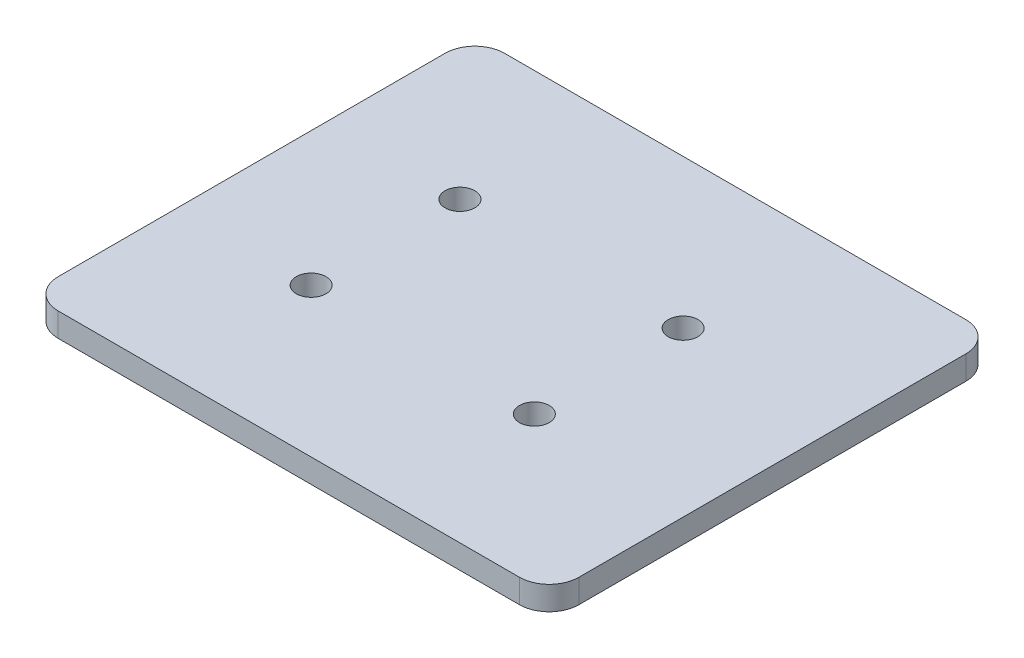
ISO-10303-21;
HEADER;
FILE_DESCRIPTION(('STEP AP214'),'2;1');
FILE_NAME('part.step','',(''),(''),'','','');
FILE_SCHEMA(('AUTOMOTIVE_DESIGN { 1 0 10303 214 1 1 1 1 }'));
ENDSEC;
DATA;
#1=APPLICATION_CONTEXT('core data for automotive mechanical design processes');
#2=APPLICATION_PROTOCOL_DEFINITION('international standard','automotive_design',2000,#1);
#3=PRODUCT_CONTEXT('',#1,'mechanical');
#4=PRODUCT('Part','Part','',(#3));
#5=PRODUCT_RELATED_PRODUCT_CATEGORY('part','',(#4));
#6=PRODUCT_DEFINITION_FORMATION('','',#4);
#7=PRODUCT_DEFINITION_CONTEXT('part definition',#1,'design');
#8=PRODUCT_DEFINITION('design','',#6,#7);
#9=PRODUCT_DEFINITION_SHAPE('','',#8);
#10=(LENGTH_UNIT() NAMED_UNIT(*) SI_UNIT(.MILLI.,.METRE.));
#11=(NAMED_UNIT(*) PLANE_ANGLE_UNIT() SI_UNIT($,.RADIAN.));
#12=(NAMED_UNIT(*) SI_UNIT($,.STERADIAN.) SOLID_ANGLE_UNIT());
#13=UNCERTAINTY_MEASURE_WITH_UNIT(LENGTH_MEASURE(1.E-05),#10,'distance_accuracy_value','');
#14=(GEOMETRIC_REPRESENTATION_CONTEXT(3) GLOBAL_UNCERTAINTY_ASSIGNED_CONTEXT((#13)) GLOBAL_UNIT_ASSIGNED_CONTEXT((#10,
#11,#12)) REPRESENTATION_CONTEXT('',''));
#15=CARTESIAN_POINT('',(0.,0.,0.));
#16=DIRECTION('',(0.,0.,1.));
#17=DIRECTION('',(1.,0.,0.));
#18=AXIS2_PLACEMENT_3D('',#15,#16,#17);
#19=CARTESIAN_POINT('',(0.,1.6,0.));
#20=DIRECTION('',(0.,-1.,0.));
#21=DIRECTION('',(0.,0.,-1.));
#22=AXIS2_PLACEMENT_3D('',#19,#20,#21);
#23=PLANE('',#22);
#24=DIRECTION('',(-1.,0.,0.));
#25=VECTOR('',#24,1.);
#26=CARTESIAN_POINT('',(-17.5,1.6,-15.));
#27=LINE('',#26,#25);
#28=CARTESIAN_POINT('',(15.5,1.6,-15.));
#29=VERTEX_POINT('',#28);
#30=CARTESIAN_POINT('',(-15.5,1.6,-15.));
#31=VERTEX_POINT('',#30);
#32=EDGE_CURVE('E179',#29,#31,#27,.T.);
#33=ORIENTED_EDGE('',*,*,#32,.T.);
#34=CARTESIAN_POINT('',(-15.5,1.6,-13.));
#35=DIRECTION('',(0.,-1.,0.));
#36=DIRECTION('',(0.,0.,-1.));
#37=AXIS2_PLACEMENT_3D('',#34,#35,#36);
#38=CIRCLE('',#37,2.);
#39=CARTESIAN_POINT('',(-17.5,1.6,-13.));
#40=VERTEX_POINT('',#39);
#41=EDGE_CURVE('E156',#31,#40,#38,.F.);
#42=ORIENTED_EDGE('',*,*,#41,.T.);
#43=DIRECTION('',(0.,0.,1.));
#44=VECTOR('',#43,1.);
#45=CARTESIAN_POINT('',(-17.5,1.6,15.));
#46=LINE('',#45,#44);
#47=CARTESIAN_POINT('',(-17.5,1.6,13.));
#48=VERTEX_POINT('',#47);
#49=EDGE_CURVE('E126',#40,#48,#46,.T.);
#50=ORIENTED_EDGE('',*,*,#49,.T.);
#51=CARTESIAN_POINT('',(-15.5,1.6,13.));
#52=DIRECTION('',(0.,-1.,0.));
#53=DIRECTION('',(0.,0.,-1.));
#54=AXIS2_PLACEMENT_3D('',#51,#52,#53);
#55=CIRCLE('',#54,2.);
#56=CARTESIAN_POINT('',(-15.5,1.6,15.));
#57=VERTEX_POINT('',#56);
#58=EDGE_CURVE('E63',#48,#57,#55,.F.);
#59=ORIENTED_EDGE('',*,*,#58,.T.);
#60=DIRECTION('',(1.,0.,0.));
#61=VECTOR('',#60,1.);
#62=CARTESIAN_POINT('',(-17.5,1.6,15.));
#63=LINE('',#62,#61);
#64=CARTESIAN_POINT('',(15.5,1.6,15.));
#65=VERTEX_POINT('',#64);
#66=EDGE_CURVE('E142',#57,#65,#63,.T.);
#67=ORIENTED_EDGE('',*,*,#66,.T.);
#68=CARTESIAN_POINT('',(15.5,1.6,13.));
#69=DIRECTION('',(0.,-1.,0.));
#70=DIRECTION('',(0.,0.,-1.));
#71=AXIS2_PLACEMENT_3D('',#68,#69,#70);
#72=CIRCLE('',#71,2.);
#73=CARTESIAN_POINT('',(17.5,1.6,13.));
#74=VERTEX_POINT('',#73);
#75=EDGE_CURVE('E151',#65,#74,#72,.F.);
#76=ORIENTED_EDGE('',*,*,#75,.T.);
#77=DIRECTION('',(0.,0.,-1.));
#78=VECTOR('',#77,1.);
#79=CARTESIAN_POINT('',(17.5,1.6,15.));
#80=LINE('',#79,#78);
#81=CARTESIAN_POINT('',(17.5,1.6,-13.));
#82=VERTEX_POINT('',#81);
#83=EDGE_CURVE('E136',#74,#82,#80,.T.);
#84=ORIENTED_EDGE('',*,*,#83,.T.);
#85=CARTESIAN_POINT('',(15.5,1.6,-13.));
#86=DIRECTION('',(0.,-1.,0.));
#87=DIRECTION('',(0.,0.,-1.));
#88=AXIS2_PLACEMENT_3D('',#85,#86,#87);
#89=CIRCLE('',#88,2.);
#90=EDGE_CURVE('E153',#82,#29,#89,.F.);
#91=ORIENTED_EDGE('',*,*,#90,.T.);
#92=EDGE_LOOP('',(#33,#42,#50,#59,#67,#76,#84,#91));
#93=FACE_BOUND('',#92,.T.);
#94=CARTESIAN_POINT('',(-8.50000000000001,1.6,-5.));
#95=DIRECTION('',(0.,1.,0.));
#96=DIRECTION('',(0.,0.,1.));
#97=AXIS2_PLACEMENT_3D('',#94,#95,#96);
#98=CIRCLE('',#97,1.);
#99=CARTESIAN_POINT('',(-8.50000000000001,1.6,-4.));
#100=VERTEX_POINT('',#99);
#101=EDGE_CURVE('E172',#100,#100,#98,.T.);
#102=ORIENTED_EDGE('',*,*,#101,.F.);
#103=EDGE_LOOP('',(#102));
#104=FACE_BOUND('',#103,.T.);
#105=CARTESIAN_POINT('',(6.49999999999999,1.6,-5.));
#106=DIRECTION('',(0.,1.,0.));
#107=DIRECTION('',(0.,0.,1.));
#108=AXIS2_PLACEMENT_3D('',#105,#106,#107);
#109=CIRCLE('',#108,1.);
#110=CARTESIAN_POINT('',(6.49999999999999,1.6,-3.99999999999999));
#111=VERTEX_POINT('',#110);
#112=EDGE_CURVE('E184',#111,#111,#109,.T.);
#113=ORIENTED_EDGE('',*,*,#112,.F.);
#114=EDGE_LOOP('',(#113));
#115=FACE_BOUND('',#114,.T.);
#116=CARTESIAN_POINT('',(-8.50000000000001,1.6,5.));
#117=DIRECTION('',(0.,1.,0.));
#118=DIRECTION('',(0.,0.,1.));
#119=AXIS2_PLACEMENT_3D('',#116,#117,#118);
#120=CIRCLE('',#119,1.);
#121=CARTESIAN_POINT('',(-8.50000000000001,1.6,6.));
#122=VERTEX_POINT('',#121);
#123=EDGE_CURVE('E189',#122,#122,#120,.T.);
#124=ORIENTED_EDGE('',*,*,#123,.F.);
#125=EDGE_LOOP('',(#124));
#126=FACE_BOUND('',#125,.T.);
#127=CARTESIAN_POINT('',(6.49999999999999,1.6,5.));
#128=DIRECTION('',(0.,1.,0.));
#129=DIRECTION('',(0.,0.,1.));
#130=AXIS2_PLACEMENT_3D('',#127,#128,#129);
#131=CIRCLE('',#130,1.);
#132=CARTESIAN_POINT('',(6.49999999999999,1.6,6.));
#133=VERTEX_POINT('',#132);
#134=EDGE_CURVE('E195',#133,#133,#131,.T.);
#135=ORIENTED_EDGE('',*,*,#134,.F.);
#136=EDGE_LOOP('',(#135));
#137=FACE_BOUND('',#136,.T.);
#138=ADVANCED_FACE('F41',(#93,#104,#115,#126,#137),#23,.F.);
#139=CARTESIAN_POINT('',(0.,0.,0.));
#140=DIRECTION('',(0.,-1.,0.));
#141=DIRECTION('',(0.,0.,-1.));
#142=AXIS2_PLACEMENT_3D('',#139,#140,#141);
#143=PLANE('',#142);
#144=CARTESIAN_POINT('',(-8.50000000000001,0.,5.));
#145=DIRECTION('',(0.,1.,0.));
#146=DIRECTION('',(0.,0.,1.));
#147=AXIS2_PLACEMENT_3D('',#144,#145,#146);
#148=CIRCLE('',#147,1.);
#149=CARTESIAN_POINT('',(-8.50000000000001,0.,6.));
#150=VERTEX_POINT('',#149);
#151=EDGE_CURVE('E192',#150,#150,#148,.T.);
#152=ORIENTED_EDGE('',*,*,#151,.T.);
#153=EDGE_LOOP('',(#152));
#154=FACE_BOUND('',#153,.T.);
#155=CARTESIAN_POINT('',(-8.50000000000001,0.,-5.));
#156=DIRECTION('',(0.,1.,0.));
#157=DIRECTION('',(0.,0.,1.));
#158=AXIS2_PLACEMENT_3D('',#155,#156,#157);
#159=CIRCLE('',#158,1.);
#160=CARTESIAN_POINT('',(-8.50000000000001,0.,-4.));
#161=VERTEX_POINT('',#160);
#162=EDGE_CURVE('E174',#161,#161,#159,.T.);
#163=ORIENTED_EDGE('',*,*,#162,.T.);
#164=EDGE_LOOP('',(#163));
#165=FACE_BOUND('',#164,.T.);
#166=DIRECTION('',(0.,0.,1.));
#167=VECTOR('',#166,1.);
#168=CARTESIAN_POINT('',(-17.5,0.,15.));
#169=LINE('',#168,#167);
#170=CARTESIAN_POINT('',(-17.5,0.,-13.));
#171=VERTEX_POINT('',#170);
#172=CARTESIAN_POINT('',(-17.5,0.,13.));
#173=VERTEX_POINT('',#172);
#174=EDGE_CURVE('E124',#171,#173,#169,.T.);
#175=ORIENTED_EDGE('',*,*,#174,.F.);
#176=CARTESIAN_POINT('',(-15.5,0.,-13.));
#177=DIRECTION('',(0.,-1.,0.));
#178=DIRECTION('',(0.,0.,-1.));
#179=AXIS2_PLACEMENT_3D('',#176,#177,#178);
#180=CIRCLE('',#179,2.);
#181=CARTESIAN_POINT('',(-15.5,0.,-15.));
#182=VERTEX_POINT('',#181);
#183=EDGE_CURVE('E107',#171,#182,#180,.T.);
#184=ORIENTED_EDGE('',*,*,#183,.T.);
#185=DIRECTION('',(-1.,0.,0.));
#186=VECTOR('',#185,1.);
#187=CARTESIAN_POINT('',(-17.5,0.,-15.));
#188=LINE('',#187,#186);
#189=CARTESIAN_POINT('',(15.5,0.,-15.));
#190=VERTEX_POINT('',#189);
#191=EDGE_CURVE('E134',#190,#182,#188,.T.);
#192=ORIENTED_EDGE('',*,*,#191,.F.);
#193=CARTESIAN_POINT('',(15.5,0.,-13.));
#194=DIRECTION('',(0.,-1.,0.));
#195=DIRECTION('',(0.,0.,-1.));
#196=AXIS2_PLACEMENT_3D('',#193,#194,#195);
#197=CIRCLE('',#196,2.);
#198=CARTESIAN_POINT('',(17.5,0.,-13.));
#199=VERTEX_POINT('',#198);
#200=EDGE_CURVE('E145',#190,#199,#197,.T.);
#201=ORIENTED_EDGE('',*,*,#200,.T.);
#202=DIRECTION('',(0.,0.,-1.));
#203=VECTOR('',#202,1.);
#204=CARTESIAN_POINT('',(17.5,0.,15.));
#205=LINE('',#204,#203);
#206=CARTESIAN_POINT('',(17.5,0.,13.));
#207=VERTEX_POINT('',#206);
#208=EDGE_CURVE('E138',#207,#199,#205,.T.);
#209=ORIENTED_EDGE('',*,*,#208,.F.);
#210=CARTESIAN_POINT('',(15.5,0.,13.));
#211=DIRECTION('',(0.,-1.,0.));
#212=DIRECTION('',(0.,0.,-1.));
#213=AXIS2_PLACEMENT_3D('',#210,#211,#212);
#214=CIRCLE('',#213,2.);
#215=CARTESIAN_POINT('',(15.5,0.,15.));
#216=VERTEX_POINT('',#215);
#217=EDGE_CURVE('E127',#207,#216,#214,.T.);
#218=ORIENTED_EDGE('',*,*,#217,.T.);
#219=DIRECTION('',(1.,0.,0.));
#220=VECTOR('',#219,1.);
#221=CARTESIAN_POINT('',(-17.5,0.,15.));
#222=LINE('',#221,#220);
#223=CARTESIAN_POINT('',(-15.5,0.,15.));
#224=VERTEX_POINT('',#223);
#225=EDGE_CURVE('E133',#224,#216,#222,.T.);
#226=ORIENTED_EDGE('',*,*,#225,.F.);
#227=CARTESIAN_POINT('',(-15.5,0.,13.));
#228=DIRECTION('',(0.,-1.,0.));
#229=DIRECTION('',(0.,0.,-1.));
#230=AXIS2_PLACEMENT_3D('',#227,#228,#229);
#231=CIRCLE('',#230,2.);
#232=EDGE_CURVE('E118',#224,#173,#231,.T.);
#233=ORIENTED_EDGE('',*,*,#232,.T.);
#234=EDGE_LOOP('',(#175,#184,#192,#201,#209,#218,#226,#233));
#235=FACE_BOUND('',#234,.T.);
#236=CARTESIAN_POINT('',(6.49999999999999,0.,-5.));
#237=DIRECTION('',(0.,1.,0.));
#238=DIRECTION('',(0.,0.,1.));
#239=AXIS2_PLACEMENT_3D('',#236,#237,#238);
#240=CIRCLE('',#239,1.);
#241=CARTESIAN_POINT('',(6.49999999999999,0.,-3.99999999999999));
#242=VERTEX_POINT('',#241);
#243=EDGE_CURVE('E186',#242,#242,#240,.T.);
#244=ORIENTED_EDGE('',*,*,#243,.T.);
#245=EDGE_LOOP('',(#244));
#246=FACE_BOUND('',#245,.T.);
#247=CARTESIAN_POINT('',(6.49999999999999,0.,5.));
#248=DIRECTION('',(0.,1.,0.));
#249=DIRECTION('',(0.,0.,1.));
#250=AXIS2_PLACEMENT_3D('',#247,#248,#249);
#251=CIRCLE('',#250,1.);
#252=CARTESIAN_POINT('',(6.49999999999999,0.,6.));
#253=VERTEX_POINT('',#252);
#254=EDGE_CURVE('E198',#253,#253,#251,.T.);
#255=ORIENTED_EDGE('',*,*,#254,.T.);
#256=EDGE_LOOP('',(#255));
#257=FACE_BOUND('',#256,.T.);
#258=ADVANCED_FACE('F130',(#154,#165,#235,#246,#257),#143,.T.);
#259=CARTESIAN_POINT('',(17.5,1.6,15.));
#260=DIRECTION('',(-1.,0.,0.));
#261=DIRECTION('',(0.,0.,1.));
#262=AXIS2_PLACEMENT_3D('',#259,#260,#261);
#263=PLANE('',#262);
#264=ORIENTED_EDGE('',*,*,#208,.T.);
#265=DIRECTION('',(0.,-1.,0.));
#266=VECTOR('',#265,1.);
#267=CARTESIAN_POINT('',(17.5,1.6,-13.));
#268=LINE('',#267,#266);
#269=EDGE_CURVE('E11',#199,#82,#268,.F.);
#270=ORIENTED_EDGE('',*,*,#269,.T.);
#271=ORIENTED_EDGE('',*,*,#83,.F.);
#272=DIRECTION('',(0.,-1.,0.));
#273=VECTOR('',#272,1.);
#274=CARTESIAN_POINT('',(17.5,1.6,13.));
#275=LINE('',#274,#273);
#276=EDGE_CURVE('E49',#74,#207,#275,.T.);
#277=ORIENTED_EDGE('',*,*,#276,.T.);
#278=EDGE_LOOP('',(#264,#270,#271,#277));
#279=FACE_BOUND('',#278,.T.);
#280=ADVANCED_FACE('F167',(#279),#263,.F.);
#281=CARTESIAN_POINT('',(-17.5,1.6,-15.));
#282=DIRECTION('',(0.,0.,1.));
#283=DIRECTION('',(1.,0.,0.));
#284=AXIS2_PLACEMENT_3D('',#281,#282,#283);
#285=PLANE('',#284);
#286=ORIENTED_EDGE('',*,*,#191,.T.);
#287=DIRECTION('',(0.,-1.,0.));
#288=VECTOR('',#287,1.);
#289=CARTESIAN_POINT('',(-15.5,1.6,-15.));
#290=LINE('',#289,#288);
#291=EDGE_CURVE('E112',#182,#31,#290,.F.);
#292=ORIENTED_EDGE('',*,*,#291,.T.);
#293=ORIENTED_EDGE('',*,*,#32,.F.);
#294=DIRECTION('',(0.,-1.,0.));
#295=VECTOR('',#294,1.);
#296=CARTESIAN_POINT('',(15.5,1.6,-15.));
#297=LINE('',#296,#295);
#298=EDGE_CURVE('E117',#29,#190,#297,.T.);
#299=ORIENTED_EDGE('',*,*,#298,.T.);
#300=EDGE_LOOP('',(#286,#292,#293,#299));
#301=FACE_BOUND('',#300,.T.);
#302=ADVANCED_FACE('F225',(#301),#285,.F.);
#303=CARTESIAN_POINT('',(-17.5,1.6,15.));
#304=DIRECTION('',(1.,0.,0.));
#305=DIRECTION('',(0.,0.,-1.));
#306=AXIS2_PLACEMENT_3D('',#303,#304,#305);
#307=PLANE('',#306);
#308=ORIENTED_EDGE('',*,*,#49,.F.);
#309=DIRECTION('',(0.,-1.,0.));
#310=VECTOR('',#309,1.);
#311=CARTESIAN_POINT('',(-17.5,1.6,-13.));
#312=LINE('',#311,#310);
#313=EDGE_CURVE('E111',#40,#171,#312,.T.);
#314=ORIENTED_EDGE('',*,*,#313,.T.);
#315=ORIENTED_EDGE('',*,*,#174,.T.);
#316=DIRECTION('',(0.,-1.,0.));
#317=VECTOR('',#316,1.);
#318=CARTESIAN_POINT('',(-17.5,1.6,13.));
#319=LINE('',#318,#317);
#320=EDGE_CURVE('E128',#173,#48,#319,.F.);
#321=ORIENTED_EDGE('',*,*,#320,.T.);
#322=EDGE_LOOP('',(#308,#314,#315,#321));
#323=FACE_BOUND('',#322,.T.);
#324=ADVANCED_FACE('F123',(#323),#307,.F.);
#325=CARTESIAN_POINT('',(-17.5,1.6,15.));
#326=DIRECTION('',(0.,0.,-1.));
#327=DIRECTION('',(-1.,0.,0.));
#328=AXIS2_PLACEMENT_3D('',#325,#326,#327);
#329=PLANE('',#328);
#330=ORIENTED_EDGE('',*,*,#66,.F.);
#331=DIRECTION('',(0.,-1.,0.));
#332=VECTOR('',#331,1.);
#333=CARTESIAN_POINT('',(-15.5,1.6,15.));
#334=LINE('',#333,#332);
#335=EDGE_CURVE('E159',#57,#224,#334,.T.);
#336=ORIENTED_EDGE('',*,*,#335,.T.);
#337=ORIENTED_EDGE('',*,*,#225,.T.);
#338=DIRECTION('',(0.,-1.,0.));
#339=VECTOR('',#338,1.);
#340=CARTESIAN_POINT('',(15.5,1.6,15.));
#341=LINE('',#340,#339);
#342=EDGE_CURVE('E56',#216,#65,#341,.F.);
#343=ORIENTED_EDGE('',*,*,#342,.T.);
#344=EDGE_LOOP('',(#330,#336,#337,#343));
#345=FACE_BOUND('',#344,.T.);
#346=ADVANCED_FACE('F220',(#345),#329,.F.);
#347=CARTESIAN_POINT('',(-8.50000000000001,1.6,-5.));
#348=DIRECTION('',(0.,-1.,0.));
#349=DIRECTION('',(0.,0.,-1.));
#350=AXIS2_PLACEMENT_3D('',#347,#348,#349);
#351=CYLINDRICAL_SURFACE('',#350,1.);
#352=ORIENTED_EDGE('',*,*,#101,.T.);
#353=EDGE_LOOP('',(#352));
#354=FACE_BOUND('',#353,.T.);
#355=ORIENTED_EDGE('',*,*,#162,.F.);
#356=EDGE_LOOP('',(#355));
#357=FACE_BOUND('',#356,.T.);
#358=ADVANCED_FACE('F217',(#354,#357),#351,.F.);
#359=CARTESIAN_POINT('',(6.49999999999999,1.6,-5.));
#360=DIRECTION('',(0.,-1.,0.));
#361=DIRECTION('',(0.,0.,-1.));
#362=AXIS2_PLACEMENT_3D('',#359,#360,#361);
#363=CYLINDRICAL_SURFACE('',#362,1.);
#364=ORIENTED_EDGE('',*,*,#112,.T.);
#365=EDGE_LOOP('',(#364));
#366=FACE_BOUND('',#365,.T.);
#367=ORIENTED_EDGE('',*,*,#243,.F.);
#368=EDGE_LOOP('',(#367));
#369=FACE_BOUND('',#368,.T.);
#370=ADVANCED_FACE('F282',(#366,#369),#363,.F.);
#371=CARTESIAN_POINT('',(-8.50000000000001,1.6,5.));
#372=DIRECTION('',(0.,-1.,0.));
#373=DIRECTION('',(0.,0.,-1.));
#374=AXIS2_PLACEMENT_3D('',#371,#372,#373);
#375=CYLINDRICAL_SURFACE('',#374,1.);
#376=ORIENTED_EDGE('',*,*,#123,.T.);
#377=EDGE_LOOP('',(#376));
#378=FACE_BOUND('',#377,.T.);
#379=ORIENTED_EDGE('',*,*,#151,.F.);
#380=EDGE_LOOP('',(#379));
#381=FACE_BOUND('',#380,.T.);
#382=ADVANCED_FACE('F273',(#378,#381),#375,.F.);
#383=CARTESIAN_POINT('',(6.49999999999999,1.6,5.));
#384=DIRECTION('',(0.,-1.,0.));
#385=DIRECTION('',(0.,0.,-1.));
#386=AXIS2_PLACEMENT_3D('',#383,#384,#385);
#387=CYLINDRICAL_SURFACE('',#386,1.);
#388=ORIENTED_EDGE('',*,*,#134,.T.);
#389=EDGE_LOOP('',(#388));
#390=FACE_BOUND('',#389,.T.);
#391=ORIENTED_EDGE('',*,*,#254,.F.);
#392=EDGE_LOOP('',(#391));
#393=FACE_BOUND('',#392,.T.);
#394=ADVANCED_FACE('F204',(#390,#393),#387,.F.);
#395=CARTESIAN_POINT('',(-15.5,1.6,-13.));
#396=DIRECTION('',(0.,-1.,0.));
#397=DIRECTION('',(0.,0.,-1.));
#398=AXIS2_PLACEMENT_3D('',#395,#396,#397);
#399=CYLINDRICAL_SURFACE('',#398,2.);
#400=ORIENTED_EDGE('',*,*,#41,.F.);
#401=ORIENTED_EDGE('',*,*,#291,.F.);
#402=ORIENTED_EDGE('',*,*,#183,.F.);
#403=ORIENTED_EDGE('',*,*,#313,.F.);
#404=EDGE_LOOP('',(#400,#401,#402,#403));
#405=FACE_BOUND('',#404,.T.);
#406=ADVANCED_FACE('F110',(#405),#399,.T.);
#407=CARTESIAN_POINT('',(-15.5,1.6,13.));
#408=DIRECTION('',(0.,-1.,0.));
#409=DIRECTION('',(0.,0.,-1.));
#410=AXIS2_PLACEMENT_3D('',#407,#408,#409);
#411=CYLINDRICAL_SURFACE('',#410,2.);
#412=ORIENTED_EDGE('',*,*,#58,.F.);
#413=ORIENTED_EDGE('',*,*,#320,.F.);
#414=ORIENTED_EDGE('',*,*,#232,.F.);
#415=ORIENTED_EDGE('',*,*,#335,.F.);
#416=EDGE_LOOP('',(#412,#413,#414,#415));
#417=FACE_BOUND('',#416,.T.);
#418=ADVANCED_FACE('F233',(#417),#411,.T.);
#419=CARTESIAN_POINT('',(15.5,1.6,-13.));
#420=DIRECTION('',(0.,-1.,0.));
#421=DIRECTION('',(0.,0.,-1.));
#422=AXIS2_PLACEMENT_3D('',#419,#420,#421);
#423=CYLINDRICAL_SURFACE('',#422,2.);
#424=ORIENTED_EDGE('',*,*,#90,.F.);
#425=ORIENTED_EDGE('',*,*,#269,.F.);
#426=ORIENTED_EDGE('',*,*,#200,.F.);
#427=ORIENTED_EDGE('',*,*,#298,.F.);
#428=EDGE_LOOP('',(#424,#425,#426,#427));
#429=FACE_BOUND('',#428,.T.);
#430=ADVANCED_FACE('F235',(#429),#423,.T.);
#431=CARTESIAN_POINT('',(15.5,1.6,13.));
#432=DIRECTION('',(0.,-1.,0.));
#433=DIRECTION('',(0.,0.,-1.));
#434=AXIS2_PLACEMENT_3D('',#431,#432,#433);
#435=CYLINDRICAL_SURFACE('',#434,2.);
#436=ORIENTED_EDGE('',*,*,#75,.F.);
#437=ORIENTED_EDGE('',*,*,#342,.F.);
#438=ORIENTED_EDGE('',*,*,#217,.F.);
#439=ORIENTED_EDGE('',*,*,#276,.F.);
#440=EDGE_LOOP('',(#436,#437,#438,#439));
#441=FACE_BOUND('',#440,.T.);
#442=ADVANCED_FACE('F43',(#441),#435,.T.);
#443=CLOSED_SHELL('',(#138,#258,#280,#302,#324,#346,#358,#370,#382,#394,#406,#418,#430,#442));
#444=MANIFOLD_SOLID_BREP('B2',#443);
#445=ADVANCED_BREP_SHAPE_REPRESENTATION('',(#18,#444),#14);
#446=SHAPE_DEFINITION_REPRESENTATION(#9,#445);
ENDSEC;
END-ISO-10303-21;
